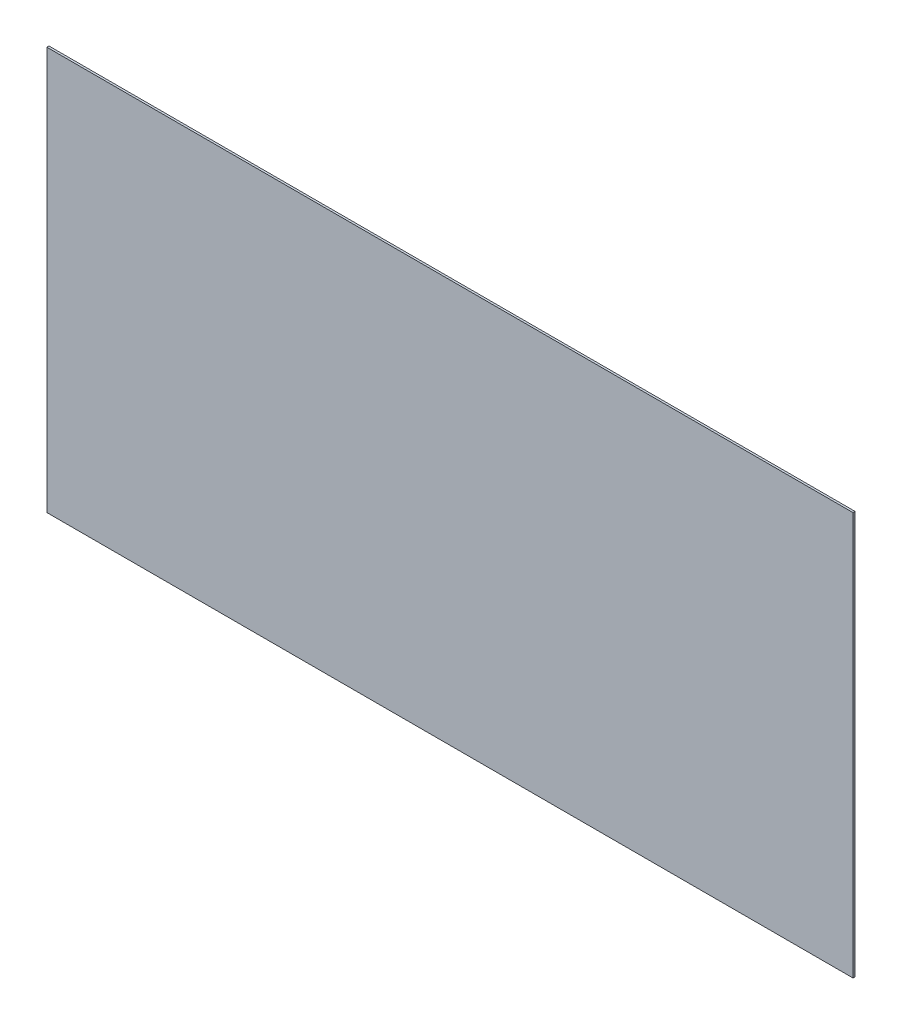
ISO-10303-21;
HEADER;
FILE_DESCRIPTION(('STEP AP214'),'2;1');
FILE_NAME('part.step','',(''),(''),'','','');
FILE_SCHEMA(('AUTOMOTIVE_DESIGN { 1 0 10303 214 1 1 1 1 }'));
ENDSEC;
DATA;
#1=APPLICATION_CONTEXT('core data for automotive mechanical design processes');
#2=APPLICATION_PROTOCOL_DEFINITION('international standard','automotive_design',2000,#1);
#3=PRODUCT_CONTEXT('',#1,'mechanical');
#4=PRODUCT('Part','Part','',(#3));
#5=PRODUCT_RELATED_PRODUCT_CATEGORY('part','',(#4));
#6=PRODUCT_DEFINITION_FORMATION('','',#4);
#7=PRODUCT_DEFINITION_CONTEXT('part definition',#1,'design');
#8=PRODUCT_DEFINITION('design','',#6,#7);
#9=PRODUCT_DEFINITION_SHAPE('','',#8);
#10=(LENGTH_UNIT() NAMED_UNIT(*) SI_UNIT(.MILLI.,.METRE.));
#11=(NAMED_UNIT(*) PLANE_ANGLE_UNIT() SI_UNIT($,.RADIAN.));
#12=(NAMED_UNIT(*) SI_UNIT($,.STERADIAN.) SOLID_ANGLE_UNIT());
#13=UNCERTAINTY_MEASURE_WITH_UNIT(LENGTH_MEASURE(1.E-05),#10,'distance_accuracy_value','');
#14=(GEOMETRIC_REPRESENTATION_CONTEXT(3) GLOBAL_UNCERTAINTY_ASSIGNED_CONTEXT((#13)) GLOBAL_UNIT_ASSIGNED_CONTEXT((#10,
#11,#12)) REPRESENTATION_CONTEXT('',''));
#15=CARTESIAN_POINT('',(0.,0.,0.));
#16=DIRECTION('',(0.,0.,1.));
#17=DIRECTION('',(1.,0.,0.));
#18=AXIS2_PLACEMENT_3D('',#15,#16,#17);
#19=CARTESIAN_POINT('',(304.8,-152.4,1.5875));
#20=DIRECTION('',(-1.,0.,0.));
#21=DIRECTION('',(0.,0.,1.));
#22=AXIS2_PLACEMENT_3D('',#19,#20,#21);
#23=PLANE('',#22);
#24=DIRECTION('',(0.,1.,0.));
#25=VECTOR('',#24,1.);
#26=CARTESIAN_POINT('',(304.8,-152.4,0.));
#27=LINE('',#26,#25);
#28=CARTESIAN_POINT('',(304.8,-152.4,0.));
#29=VERTEX_POINT('',#28);
#30=CARTESIAN_POINT('',(304.8,152.4,0.));
#31=VERTEX_POINT('',#30);
#32=EDGE_CURVE('E96',#29,#31,#27,.T.);
#33=ORIENTED_EDGE('',*,*,#32,.T.);
#34=DIRECTION('',(0.,0.,-1.));
#35=VECTOR('',#34,1.);
#36=CARTESIAN_POINT('',(304.8,152.4,1.5875));
#37=LINE('',#36,#35);
#38=CARTESIAN_POINT('',(304.8,152.4,1.5875));
#39=VERTEX_POINT('',#38);
#40=EDGE_CURVE('E11',#39,#31,#37,.T.);
#41=ORIENTED_EDGE('',*,*,#40,.F.);
#42=DIRECTION('',(0.,1.,0.));
#43=VECTOR('',#42,1.);
#44=CARTESIAN_POINT('',(304.8,-152.4,1.5875));
#45=LINE('',#44,#43);
#46=CARTESIAN_POINT('',(304.8,-152.4,1.5875));
#47=VERTEX_POINT('',#46);
#48=EDGE_CURVE('E84',#47,#39,#45,.T.);
#49=ORIENTED_EDGE('',*,*,#48,.F.);
#50=DIRECTION('',(0.,0.,-1.));
#51=VECTOR('',#50,1.);
#52=CARTESIAN_POINT('',(304.8,-152.4,1.5875));
#53=LINE('',#52,#51);
#54=EDGE_CURVE('E92',#47,#29,#53,.T.);
#55=ORIENTED_EDGE('',*,*,#54,.T.);
#56=EDGE_LOOP('',(#33,#41,#49,#55));
#57=FACE_BOUND('',#56,.T.);
#58=ADVANCED_FACE('F33',(#57),#23,.F.);
#59=CARTESIAN_POINT('',(-304.8,152.4,1.5875));
#60=DIRECTION('',(0.,-1.,0.));
#61=DIRECTION('',(0.,0.,-1.));
#62=AXIS2_PLACEMENT_3D('',#59,#60,#61);
#63=PLANE('',#62);
#64=DIRECTION('',(-1.,0.,0.));
#65=VECTOR('',#64,1.);
#66=CARTESIAN_POINT('',(-304.8,152.4,0.));
#67=LINE('',#66,#65);
#68=CARTESIAN_POINT('',(-304.8,152.4,0.));
#69=VERTEX_POINT('',#68);
#70=EDGE_CURVE('E88',#31,#69,#67,.T.);
#71=ORIENTED_EDGE('',*,*,#70,.T.);
#72=DIRECTION('',(0.,0.,-1.));
#73=VECTOR('',#72,1.);
#74=CARTESIAN_POINT('',(-304.8,152.4,1.5875));
#75=LINE('',#74,#73);
#76=CARTESIAN_POINT('',(-304.8,152.4,1.5875));
#77=VERTEX_POINT('',#76);
#78=EDGE_CURVE('E41',#77,#69,#75,.T.);
#79=ORIENTED_EDGE('',*,*,#78,.F.);
#80=DIRECTION('',(-1.,0.,0.));
#81=VECTOR('',#80,1.);
#82=CARTESIAN_POINT('',(-304.8,152.4,1.5875));
#83=LINE('',#82,#81);
#84=EDGE_CURVE('E79',#39,#77,#83,.T.);
#85=ORIENTED_EDGE('',*,*,#84,.F.);
#86=ORIENTED_EDGE('',*,*,#40,.T.);
#87=EDGE_LOOP('',(#71,#79,#85,#86));
#88=FACE_BOUND('',#87,.T.);
#89=ADVANCED_FACE('F87',(#88),#63,.F.);
#90=CARTESIAN_POINT('',(-304.8,-152.4,1.5875));
#91=DIRECTION('',(1.,0.,0.));
#92=DIRECTION('',(0.,0.,-1.));
#93=AXIS2_PLACEMENT_3D('',#90,#91,#92);
#94=PLANE('',#93);
#95=DIRECTION('',(0.,-1.,0.));
#96=VECTOR('',#95,1.);
#97=CARTESIAN_POINT('',(-304.8,-152.4,0.));
#98=LINE('',#97,#96);
#99=CARTESIAN_POINT('',(-304.8,-152.4,0.));
#100=VERTEX_POINT('',#99);
#101=EDGE_CURVE('E66',#69,#100,#98,.T.);
#102=ORIENTED_EDGE('',*,*,#101,.T.);
#103=DIRECTION('',(0.,0.,-1.));
#104=VECTOR('',#103,1.);
#105=CARTESIAN_POINT('',(-304.8,-152.4,1.5875));
#106=LINE('',#105,#104);
#107=CARTESIAN_POINT('',(-304.8,-152.4,1.5875));
#108=VERTEX_POINT('',#107);
#109=EDGE_CURVE('E89',#108,#100,#106,.T.);
#110=ORIENTED_EDGE('',*,*,#109,.F.);
#111=DIRECTION('',(0.,-1.,0.));
#112=VECTOR('',#111,1.);
#113=CARTESIAN_POINT('',(-304.8,-152.4,1.5875));
#114=LINE('',#113,#112);
#115=EDGE_CURVE('E82',#77,#108,#114,.T.);
#116=ORIENTED_EDGE('',*,*,#115,.F.);
#117=ORIENTED_EDGE('',*,*,#78,.T.);
#118=EDGE_LOOP('',(#102,#110,#116,#117));
#119=FACE_BOUND('',#118,.T.);
#120=ADVANCED_FACE('F90',(#119),#94,.F.);
#121=CARTESIAN_POINT('',(-304.8,-152.4,1.5875));
#122=DIRECTION('',(0.,1.,0.));
#123=DIRECTION('',(0.,0.,1.));
#124=AXIS2_PLACEMENT_3D('',#121,#122,#123);
#125=PLANE('',#124);
#126=DIRECTION('',(1.,0.,0.));
#127=VECTOR('',#126,1.);
#128=CARTESIAN_POINT('',(-304.8,-152.4,0.));
#129=LINE('',#128,#127);
#130=EDGE_CURVE('E72',#100,#29,#129,.T.);
#131=ORIENTED_EDGE('',*,*,#130,.T.);
#132=ORIENTED_EDGE('',*,*,#54,.F.);
#133=DIRECTION('',(1.,0.,0.));
#134=VECTOR('',#133,1.);
#135=CARTESIAN_POINT('',(-304.8,-152.4,1.5875));
#136=LINE('',#135,#134);
#137=EDGE_CURVE('E49',#108,#47,#136,.T.);
#138=ORIENTED_EDGE('',*,*,#137,.F.);
#139=ORIENTED_EDGE('',*,*,#109,.T.);
#140=EDGE_LOOP('',(#131,#132,#138,#139));
#141=FACE_BOUND('',#140,.T.);
#142=ADVANCED_FACE('F103',(#141),#125,.F.);
#143=CARTESIAN_POINT('',(0.,0.,1.5875));
#144=DIRECTION('',(0.,0.,-1.));
#145=DIRECTION('',(-1.,0.,0.));
#146=AXIS2_PLACEMENT_3D('',#143,#144,#145);
#147=PLANE('',#146);
#148=ORIENTED_EDGE('',*,*,#48,.T.);
#149=ORIENTED_EDGE('',*,*,#84,.T.);
#150=ORIENTED_EDGE('',*,*,#115,.T.);
#151=ORIENTED_EDGE('',*,*,#137,.T.);
#152=EDGE_LOOP('',(#148,#149,#150,#151));
#153=FACE_BOUND('',#152,.T.);
#154=ADVANCED_FACE('F80',(#153),#147,.F.);
#155=CARTESIAN_POINT('',(0.,0.,0.));
#156=DIRECTION('',(0.,0.,-1.));
#157=DIRECTION('',(-1.,0.,0.));
#158=AXIS2_PLACEMENT_3D('',#155,#156,#157);
#159=PLANE('',#158);
#160=ORIENTED_EDGE('',*,*,#32,.F.);
#161=ORIENTED_EDGE('',*,*,#130,.F.);
#162=ORIENTED_EDGE('',*,*,#101,.F.);
#163=ORIENTED_EDGE('',*,*,#70,.F.);
#164=EDGE_LOOP('',(#160,#161,#162,#163));
#165=FACE_BOUND('',#164,.T.);
#166=ADVANCED_FACE('F106',(#165),#159,.T.);
#167=CLOSED_SHELL('',(#58,#89,#120,#142,#154,#166));
#168=MANIFOLD_SOLID_BREP('B2',#167);
#169=ADVANCED_BREP_SHAPE_REPRESENTATION('',(#18,#168),#14);
#170=SHAPE_DEFINITION_REPRESENTATION(#9,#169);
ENDSEC;
END-ISO-10303-21;
